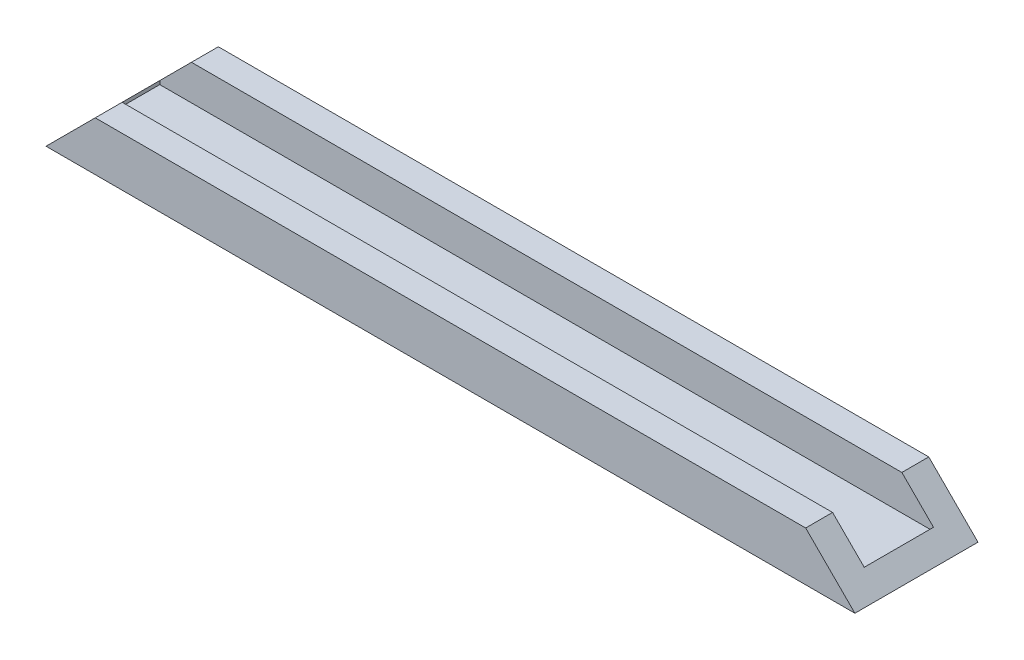
ISO-10303-21;
HEADER;
FILE_DESCRIPTION(('STEP AP214'),'2;1');
FILE_NAME('part.step','',(''),(''),'','','');
FILE_SCHEMA(('AUTOMOTIVE_DESIGN { 1 0 10303 214 1 1 1 1 }'));
ENDSEC;
DATA;
#1=APPLICATION_CONTEXT('core data for automotive mechanical design processes');
#2=APPLICATION_PROTOCOL_DEFINITION('international standard','automotive_design',2000,#1);
#3=PRODUCT_CONTEXT('',#1,'mechanical');
#4=PRODUCT('Part','Part','',(#3));
#5=PRODUCT_RELATED_PRODUCT_CATEGORY('part','',(#4));
#6=PRODUCT_DEFINITION_FORMATION('','',#4);
#7=PRODUCT_DEFINITION_CONTEXT('part definition',#1,'design');
#8=PRODUCT_DEFINITION('design','',#6,#7);
#9=PRODUCT_DEFINITION_SHAPE('','',#8);
#10=(LENGTH_UNIT() NAMED_UNIT(*) SI_UNIT(.MILLI.,.METRE.));
#11=(NAMED_UNIT(*) PLANE_ANGLE_UNIT() SI_UNIT($,.RADIAN.));
#12=(NAMED_UNIT(*) SI_UNIT($,.STERADIAN.) SOLID_ANGLE_UNIT());
#13=UNCERTAINTY_MEASURE_WITH_UNIT(LENGTH_MEASURE(1.E-05),#10,'distance_accuracy_value','');
#14=(GEOMETRIC_REPRESENTATION_CONTEXT(3) GLOBAL_UNCERTAINTY_ASSIGNED_CONTEXT((#13)) GLOBAL_UNIT_ASSIGNED_CONTEXT((#10,
#11,#12)) REPRESENTATION_CONTEXT('',''));
#15=CARTESIAN_POINT('',(0.,0.,0.));
#16=DIRECTION('',(0.,0.,1.));
#17=DIRECTION('',(1.,0.,0.));
#18=AXIS2_PLACEMENT_3D('',#15,#16,#17);
#19=CARTESIAN_POINT('',(0.,8.89,0.));
#20=DIRECTION('',(0.,-1.,0.));
#21=DIRECTION('',(0.,0.,-1.));
#22=AXIS2_PLACEMENT_3D('',#19,#20,#21);
#23=PLANE('',#22);
#24=DIRECTION('',(-1.,0.,0.));
#25=VECTOR('',#24,1.);
#26=CARTESIAN_POINT('',(0.,8.89,-22.225));
#27=LINE('',#26,#25);
#28=CARTESIAN_POINT('',(137.16,8.89000000000001,-22.225));
#29=VERTEX_POINT('',#28);
#30=CARTESIAN_POINT('',(8.89000000000008,8.89000000000001,-22.225));
#31=VERTEX_POINT('',#30);
#32=EDGE_CURVE('E129',#29,#31,#27,.T.);
#33=ORIENTED_EDGE('',*,*,#32,.T.);
#34=DIRECTION('',(0.,0.,-1.));
#35=VECTOR('',#34,1.);
#36=CARTESIAN_POINT('',(8.89000000000008,8.89000000000001,0.));
#37=LINE('',#36,#35);
#38=CARTESIAN_POINT('',(8.89000000000008,8.89000000000001,-17.36725));
#39=VERTEX_POINT('',#38);
#40=EDGE_CURVE('E115',#39,#31,#37,.T.);
#41=ORIENTED_EDGE('',*,*,#40,.F.);
#42=DIRECTION('',(-1.,0.,0.));
#43=VECTOR('',#42,1.);
#44=CARTESIAN_POINT('',(3.175,8.89,-17.36725));
#45=LINE('',#44,#43);
#46=CARTESIAN_POINT('',(137.16,8.89000000000001,-17.36725));
#47=VERTEX_POINT('',#46);
#48=EDGE_CURVE('E164',#47,#39,#45,.T.);
#49=ORIENTED_EDGE('',*,*,#48,.F.);
#50=DIRECTION('',(0.,0.,-1.));
#51=VECTOR('',#50,1.);
#52=CARTESIAN_POINT('',(137.16,8.89000000000001,0.));
#53=LINE('',#52,#51);
#54=EDGE_CURVE('E188',#47,#29,#53,.T.);
#55=ORIENTED_EDGE('',*,*,#54,.T.);
#56=EDGE_LOOP('',(#33,#41,#49,#55));
#57=FACE_BOUND('',#56,.T.);
#58=ADVANCED_FACE('F33',(#57),#23,.F.);
#59=CARTESIAN_POINT('',(0.,8.89,0.));
#60=DIRECTION('',(0.,0.,-1.));
#61=DIRECTION('',(-1.,0.,0.));
#62=AXIS2_PLACEMENT_3D('',#59,#60,#61);
#63=PLANE('',#62);
#64=DIRECTION('',(1.,0.,0.));
#65=VECTOR('',#64,1.);
#66=CARTESIAN_POINT('',(0.,8.89,0.));
#67=LINE('',#66,#65);
#68=CARTESIAN_POINT('',(8.89000000000008,8.89000000000001,0.));
#69=VERTEX_POINT('',#68);
#70=CARTESIAN_POINT('',(137.16,8.89000000000001,0.));
#71=VERTEX_POINT('',#70);
#72=EDGE_CURVE('E123',#69,#71,#67,.T.);
#73=ORIENTED_EDGE('',*,*,#72,.F.);
#74=DIRECTION('',(-0.707106781186551,-0.707106781186544,0.));
#75=VECTOR('',#74,1.);
#76=CARTESIAN_POINT('',(0.,0.,0.));
#77=LINE('',#76,#75);
#78=CARTESIAN_POINT('',(0.,0.,0.));
#79=VERTEX_POINT('',#78);
#80=EDGE_CURVE('E107',#69,#79,#77,.T.);
#81=ORIENTED_EDGE('',*,*,#80,.T.);
#82=DIRECTION('',(1.,0.,0.));
#83=VECTOR('',#82,1.);
#84=CARTESIAN_POINT('',(0.,0.,0.));
#85=LINE('',#84,#83);
#86=CARTESIAN_POINT('',(146.05,0.,0.));
#87=VERTEX_POINT('',#86);
#88=EDGE_CURVE('E142',#79,#87,#85,.T.);
#89=ORIENTED_EDGE('',*,*,#88,.T.);
#90=DIRECTION('',(-0.707106781186551,0.707106781186544,0.));
#91=VECTOR('',#90,1.);
#92=CARTESIAN_POINT('',(146.05,0.,0.));
#93=LINE('',#92,#91);
#94=EDGE_CURVE('E128',#87,#71,#93,.T.);
#95=ORIENTED_EDGE('',*,*,#94,.T.);
#96=EDGE_LOOP('',(#73,#81,#89,#95));
#97=FACE_BOUND('',#96,.T.);
#98=ADVANCED_FACE('F35',(#97),#63,.F.);
#99=CARTESIAN_POINT('',(0.,8.89,-22.225));
#100=DIRECTION('',(0.,0.,1.));
#101=DIRECTION('',(1.,0.,0.));
#102=AXIS2_PLACEMENT_3D('',#99,#100,#101);
#103=PLANE('',#102);
#104=DIRECTION('',(-1.,0.,0.));
#105=VECTOR('',#104,1.);
#106=CARTESIAN_POINT('',(0.,0.,-22.225));
#107=LINE('',#106,#105);
#108=CARTESIAN_POINT('',(146.05,0.,-22.225));
#109=VERTEX_POINT('',#108);
#110=CARTESIAN_POINT('',(0.,0.,-22.225));
#111=VERTEX_POINT('',#110);
#112=EDGE_CURVE('E130',#109,#111,#107,.T.);
#113=ORIENTED_EDGE('',*,*,#112,.T.);
#114=DIRECTION('',(-0.707106781186551,-0.707106781186544,0.));
#115=VECTOR('',#114,1.);
#116=CARTESIAN_POINT('',(0.,0.,-22.225));
#117=LINE('',#116,#115);
#118=EDGE_CURVE('E116',#31,#111,#117,.T.);
#119=ORIENTED_EDGE('',*,*,#118,.F.);
#120=ORIENTED_EDGE('',*,*,#32,.F.);
#121=DIRECTION('',(-0.707106781186551,0.707106781186544,0.));
#122=VECTOR('',#121,1.);
#123=CARTESIAN_POINT('',(146.05,0.,-22.225));
#124=LINE('',#123,#122);
#125=EDGE_CURVE('E189',#109,#29,#124,.T.);
#126=ORIENTED_EDGE('',*,*,#125,.F.);
#127=EDGE_LOOP('',(#113,#119,#120,#126));
#128=FACE_BOUND('',#127,.T.);
#129=ADVANCED_FACE('F198',(#128),#103,.F.);
#130=DIRECTION('',(1.,0.,0.));
#131=VECTOR('',#130,1.);
#132=CARTESIAN_POINT('',(3.175,8.89,-4.85775));
#133=LINE('',#132,#131);
#134=CARTESIAN_POINT('',(8.89000000000008,8.89,-4.85775));
#135=VERTEX_POINT('',#134);
#136=CARTESIAN_POINT('',(137.16,8.89000000000001,-4.85774999999998));
#137=VERTEX_POINT('',#136);
#138=EDGE_CURVE('E125',#135,#137,#133,.T.);
#139=ORIENTED_EDGE('',*,*,#138,.F.);
#140=EDGE_CURVE('E56',#69,#135,#37,.T.);
#141=ORIENTED_EDGE('',*,*,#140,.F.);
#142=ORIENTED_EDGE('',*,*,#72,.T.);
#143=EDGE_CURVE('E186',#71,#137,#53,.T.);
#144=ORIENTED_EDGE('',*,*,#143,.T.);
#145=EDGE_LOOP('',(#139,#141,#142,#144));
#146=FACE_BOUND('',#145,.T.);
#147=ADVANCED_FACE('F121',(#146),#23,.F.);
#148=CARTESIAN_POINT('',(0.,0.,0.));
#149=DIRECTION('',(0.,-1.,0.));
#150=DIRECTION('',(0.,0.,-1.));
#151=AXIS2_PLACEMENT_3D('',#148,#149,#150);
#152=PLANE('',#151);
#153=DIRECTION('',(0.,0.,1.));
#154=VECTOR('',#153,1.);
#155=CARTESIAN_POINT('',(0.,0.,0.));
#156=LINE('',#155,#154);
#157=EDGE_CURVE('E110',#111,#79,#156,.T.);
#158=ORIENTED_EDGE('',*,*,#157,.F.);
#159=ORIENTED_EDGE('',*,*,#112,.F.);
#160=DIRECTION('',(0.,0.,-1.));
#161=VECTOR('',#160,1.);
#162=CARTESIAN_POINT('',(146.05,0.,0.));
#163=LINE('',#162,#161);
#164=EDGE_CURVE('E135',#87,#109,#163,.T.);
#165=ORIENTED_EDGE('',*,*,#164,.F.);
#166=ORIENTED_EDGE('',*,*,#88,.F.);
#167=EDGE_LOOP('',(#158,#159,#165,#166));
#168=FACE_BOUND('',#167,.T.);
#169=ADVANCED_FACE('F201',(#168),#152,.T.);
#170=CARTESIAN_POINT('',(3.175,2.54,-17.36725));
#171=DIRECTION('',(-1.,0.,0.));
#172=DIRECTION('',(0.,0.,1.));
#173=AXIS2_PLACEMENT_3D('',#170,#171,#172);
#174=PLANE('',#173);
#175=DIRECTION('',(0.,1.,0.));
#176=VECTOR('',#175,1.);
#177=CARTESIAN_POINT('',(3.175,2.54,-17.36725));
#178=LINE('',#177,#176);
#179=CARTESIAN_POINT('',(3.175,2.54,-17.36725));
#180=VERTEX_POINT('',#179);
#181=CARTESIAN_POINT('',(3.175,3.17499999999998,-17.36725));
#182=VERTEX_POINT('',#181);
#183=EDGE_CURVE('E143',#180,#182,#178,.T.);
#184=ORIENTED_EDGE('',*,*,#183,.T.);
#185=DIRECTION('',(0.,0.,1.));
#186=VECTOR('',#185,1.);
#187=CARTESIAN_POINT('',(3.175,3.17499999999998,-17.36725));
#188=LINE('',#187,#186);
#189=CARTESIAN_POINT('',(3.175,3.17499999999998,-4.85775));
#190=VERTEX_POINT('',#189);
#191=EDGE_CURVE('E179',#182,#190,#188,.T.);
#192=ORIENTED_EDGE('',*,*,#191,.T.);
#193=DIRECTION('',(0.,1.,0.));
#194=VECTOR('',#193,1.);
#195=CARTESIAN_POINT('',(3.175,2.54,-4.85775));
#196=LINE('',#195,#194);
#197=CARTESIAN_POINT('',(3.175,2.54,-4.85775));
#198=VERTEX_POINT('',#197);
#199=EDGE_CURVE('E138',#198,#190,#196,.T.);
#200=ORIENTED_EDGE('',*,*,#199,.F.);
#201=DIRECTION('',(0.,0.,1.));
#202=VECTOR('',#201,1.);
#203=CARTESIAN_POINT('',(3.175,2.54,-17.36725));
#204=LINE('',#203,#202);
#205=EDGE_CURVE('E167',#180,#198,#204,.T.);
#206=ORIENTED_EDGE('',*,*,#205,.F.);
#207=EDGE_LOOP('',(#184,#192,#200,#206));
#208=FACE_BOUND('',#207,.T.);
#209=ADVANCED_FACE('F213',(#208),#174,.F.);
#210=CARTESIAN_POINT('',(3.175,2.54,-17.36725));
#211=DIRECTION('',(0.,0.,-1.));
#212=DIRECTION('',(-1.,0.,0.));
#213=AXIS2_PLACEMENT_3D('',#210,#211,#212);
#214=PLANE('',#213);
#215=ORIENTED_EDGE('',*,*,#48,.T.);
#216=DIRECTION('',(-0.707106781186551,-0.707106781186544,0.));
#217=VECTOR('',#216,1.);
#218=CARTESIAN_POINT('',(2.85750000000001,2.85749999999999,-17.36725));
#219=LINE('',#218,#217);
#220=EDGE_CURVE('E169',#39,#182,#219,.T.);
#221=ORIENTED_EDGE('',*,*,#220,.T.);
#222=ORIENTED_EDGE('',*,*,#183,.F.);
#223=DIRECTION('',(-1.,0.,0.));
#224=VECTOR('',#223,1.);
#225=CARTESIAN_POINT('',(3.175,2.54,-17.36725));
#226=LINE('',#225,#224);
#227=CARTESIAN_POINT('',(142.875,2.54,-17.36725));
#228=VERTEX_POINT('',#227);
#229=EDGE_CURVE('E160',#228,#180,#226,.T.);
#230=ORIENTED_EDGE('',*,*,#229,.F.);
#231=DIRECTION('',(0.,1.,0.));
#232=VECTOR('',#231,1.);
#233=CARTESIAN_POINT('',(142.875,2.54,-17.36725));
#234=LINE('',#233,#232);
#235=CARTESIAN_POINT('',(142.875,3.17499999999993,-17.36725));
#236=VERTEX_POINT('',#235);
#237=EDGE_CURVE('E158',#228,#236,#234,.T.);
#238=ORIENTED_EDGE('',*,*,#237,.T.);
#239=DIRECTION('',(-0.707106781186551,0.707106781186544,0.));
#240=VECTOR('',#239,1.);
#241=CARTESIAN_POINT('',(73.3424999999993,72.7075,-17.36725));
#242=LINE('',#241,#240);
#243=EDGE_CURVE('E182',#236,#47,#242,.T.);
#244=ORIENTED_EDGE('',*,*,#243,.T.);
#245=EDGE_LOOP('',(#215,#221,#222,#230,#238,#244));
#246=FACE_BOUND('',#245,.T.);
#247=ADVANCED_FACE('F207',(#246),#214,.F.);
#248=CARTESIAN_POINT('',(142.875,2.54,-17.36725));
#249=DIRECTION('',(1.,0.,0.));
#250=DIRECTION('',(0.,0.,-1.));
#251=AXIS2_PLACEMENT_3D('',#248,#249,#250);
#252=PLANE('',#251);
#253=DIRECTION('',(0.,1.,0.));
#254=VECTOR('',#253,1.);
#255=CARTESIAN_POINT('',(142.875,2.54,-4.85774999999998));
#256=LINE('',#255,#254);
#257=CARTESIAN_POINT('',(142.875,2.54,-4.85774999999998));
#258=VERTEX_POINT('',#257);
#259=CARTESIAN_POINT('',(142.875,3.17499999999988,-4.85774999999998));
#260=VERTEX_POINT('',#259);
#261=EDGE_CURVE('E150',#258,#260,#256,.T.);
#262=ORIENTED_EDGE('',*,*,#261,.T.);
#263=DIRECTION('',(0.,0.,-1.));
#264=VECTOR('',#263,1.);
#265=CARTESIAN_POINT('',(142.875,3.17499999999993,-17.36725));
#266=LINE('',#265,#264);
#267=EDGE_CURVE('E48',#260,#236,#266,.T.);
#268=ORIENTED_EDGE('',*,*,#267,.T.);
#269=ORIENTED_EDGE('',*,*,#237,.F.);
#270=DIRECTION('',(0.,0.,-1.));
#271=VECTOR('',#270,1.);
#272=CARTESIAN_POINT('',(142.875,2.54,-17.36725));
#273=LINE('',#272,#271);
#274=EDGE_CURVE('E156',#258,#228,#273,.T.);
#275=ORIENTED_EDGE('',*,*,#274,.F.);
#276=EDGE_LOOP('',(#262,#268,#269,#275));
#277=FACE_BOUND('',#276,.T.);
#278=ADVANCED_FACE('F153',(#277),#252,.F.);
#279=CARTESIAN_POINT('',(3.175,2.54,-4.85775));
#280=DIRECTION('',(0.,0.,1.));
#281=DIRECTION('',(1.,0.,0.));
#282=AXIS2_PLACEMENT_3D('',#279,#280,#281);
#283=PLANE('',#282);
#284=ORIENTED_EDGE('',*,*,#199,.T.);
#285=DIRECTION('',(0.707106781186551,0.707106781186544,0.));
#286=VECTOR('',#285,1.);
#287=CARTESIAN_POINT('',(2.85750000000001,2.85749999999999,-4.85775));
#288=LINE('',#287,#286);
#289=EDGE_CURVE('E11',#190,#135,#288,.T.);
#290=ORIENTED_EDGE('',*,*,#289,.T.);
#291=ORIENTED_EDGE('',*,*,#138,.T.);
#292=DIRECTION('',(0.707106781186551,-0.707106781186544,0.));
#293=VECTOR('',#292,1.);
#294=CARTESIAN_POINT('',(73.3424999999993,72.7075,-4.85774999999999));
#295=LINE('',#294,#293);
#296=EDGE_CURVE('E41',#137,#260,#295,.T.);
#297=ORIENTED_EDGE('',*,*,#296,.T.);
#298=ORIENTED_EDGE('',*,*,#261,.F.);
#299=DIRECTION('',(1.,0.,0.));
#300=VECTOR('',#299,1.);
#301=CARTESIAN_POINT('',(3.175,2.54,-4.85775));
#302=LINE('',#301,#300);
#303=EDGE_CURVE('E173',#198,#258,#302,.T.);
#304=ORIENTED_EDGE('',*,*,#303,.F.);
#305=EDGE_LOOP('',(#284,#290,#291,#297,#298,#304));
#306=FACE_BOUND('',#305,.T.);
#307=ADVANCED_FACE('F148',(#306),#283,.F.);
#308=CARTESIAN_POINT('',(0.,2.54,0.));
#309=DIRECTION('',(0.,1.,0.));
#310=DIRECTION('',(0.,0.,1.));
#311=AXIS2_PLACEMENT_3D('',#308,#309,#310);
#312=PLANE('',#311);
#313=ORIENTED_EDGE('',*,*,#205,.T.);
#314=ORIENTED_EDGE('',*,*,#303,.T.);
#315=ORIENTED_EDGE('',*,*,#274,.T.);
#316=ORIENTED_EDGE('',*,*,#229,.T.);
#317=EDGE_LOOP('',(#313,#314,#315,#316));
#318=FACE_BOUND('',#317,.T.);
#319=ADVANCED_FACE('F210',(#318),#312,.T.);
#320=CARTESIAN_POINT('',(146.05,0.,0.));
#321=DIRECTION('',(-0.707106781186544,-0.707106781186551,0.));
#322=DIRECTION('',(0.707106781186551,-0.707106781186544,0.));
#323=AXIS2_PLACEMENT_3D('',#320,#321,#322);
#324=PLANE('',#323);
#325=ORIENTED_EDGE('',*,*,#267,.F.);
#326=ORIENTED_EDGE('',*,*,#296,.F.);
#327=ORIENTED_EDGE('',*,*,#143,.F.);
#328=ORIENTED_EDGE('',*,*,#94,.F.);
#329=ORIENTED_EDGE('',*,*,#164,.T.);
#330=ORIENTED_EDGE('',*,*,#125,.T.);
#331=ORIENTED_EDGE('',*,*,#54,.F.);
#332=ORIENTED_EDGE('',*,*,#243,.F.);
#333=EDGE_LOOP('',(#325,#326,#327,#328,#329,#330,#331,#332));
#334=FACE_BOUND('',#333,.T.);
#335=ADVANCED_FACE('F202',(#334),#324,.F.);
#336=CARTESIAN_POINT('',(0.,0.,0.));
#337=DIRECTION('',(0.707106781186544,-0.707106781186551,0.));
#338=DIRECTION('',(0.707106781186551,0.707106781186544,0.));
#339=AXIS2_PLACEMENT_3D('',#336,#337,#338);
#340=PLANE('',#339);
#341=ORIENTED_EDGE('',*,*,#40,.T.);
#342=ORIENTED_EDGE('',*,*,#118,.T.);
#343=ORIENTED_EDGE('',*,*,#157,.T.);
#344=ORIENTED_EDGE('',*,*,#80,.F.);
#345=ORIENTED_EDGE('',*,*,#140,.T.);
#346=ORIENTED_EDGE('',*,*,#289,.F.);
#347=ORIENTED_EDGE('',*,*,#191,.F.);
#348=ORIENTED_EDGE('',*,*,#220,.F.);
#349=EDGE_LOOP('',(#341,#342,#343,#344,#345,#346,#347,#348));
#350=FACE_BOUND('',#349,.T.);
#351=ADVANCED_FACE('F108',(#350),#340,.F.);
#352=CLOSED_SHELL('',(#58,#98,#129,#147,#169,#209,#247,#278,#307,#319,#335,#351));
#353=MANIFOLD_SOLID_BREP('B2',#352);
#354=ADVANCED_BREP_SHAPE_REPRESENTATION('',(#18,#353),#14);
#355=SHAPE_DEFINITION_REPRESENTATION(#9,#354);
ENDSEC;
END-ISO-10303-21;
